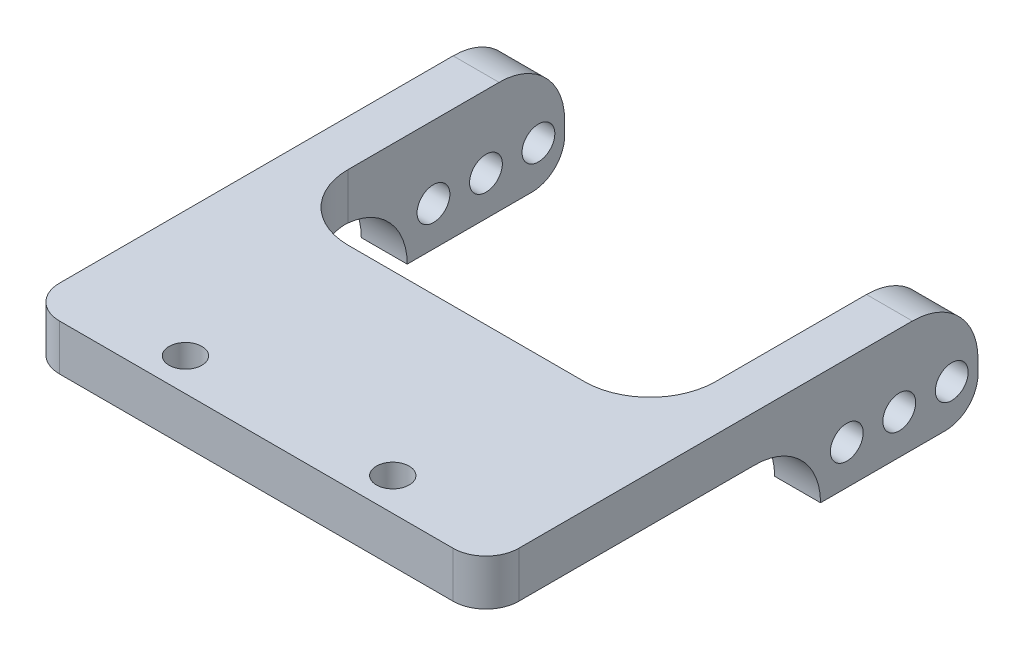
ISO-10303-21;
HEADER;
FILE_DESCRIPTION(('STEP AP214'),'2;1');
FILE_NAME('part.step','',(''),(''),'','','');
FILE_SCHEMA(('AUTOMOTIVE_DESIGN { 1 0 10303 214 1 1 1 1 }'));
ENDSEC;
DATA;
#1=APPLICATION_CONTEXT('core data for automotive mechanical design processes');
#2=APPLICATION_PROTOCOL_DEFINITION('international standard','automotive_design',2000,#1);
#3=PRODUCT_CONTEXT('',#1,'mechanical');
#4=PRODUCT('Part','Part','',(#3));
#5=PRODUCT_RELATED_PRODUCT_CATEGORY('part','',(#4));
#6=PRODUCT_DEFINITION_FORMATION('','',#4);
#7=PRODUCT_DEFINITION_CONTEXT('part definition',#1,'design');
#8=PRODUCT_DEFINITION('design','',#6,#7);
#9=PRODUCT_DEFINITION_SHAPE('','',#8);
#10=(LENGTH_UNIT() NAMED_UNIT(*) SI_UNIT(.MILLI.,.METRE.));
#11=(NAMED_UNIT(*) PLANE_ANGLE_UNIT() SI_UNIT($,.RADIAN.));
#12=(NAMED_UNIT(*) SI_UNIT($,.STERADIAN.) SOLID_ANGLE_UNIT());
#13=UNCERTAINTY_MEASURE_WITH_UNIT(LENGTH_MEASURE(1.E-05),#10,'distance_accuracy_value','');
#14=(GEOMETRIC_REPRESENTATION_CONTEXT(3) GLOBAL_UNCERTAINTY_ASSIGNED_CONTEXT((#13)) GLOBAL_UNIT_ASSIGNED_CONTEXT((#10,
#11,#12)) REPRESENTATION_CONTEXT('',''));
#15=CARTESIAN_POINT('',(0.,0.,0.));
#16=DIRECTION('',(0.,0.,1.));
#17=DIRECTION('',(1.,0.,0.));
#18=AXIS2_PLACEMENT_3D('',#15,#16,#17);
#19=CARTESIAN_POINT('',(65.,7.,70.));
#20=DIRECTION('',(0.,-1.,0.));
#21=DIRECTION('',(0.,0.,-1.));
#22=AXIS2_PLACEMENT_3D('',#19,#20,#21);
#23=CYLINDRICAL_SURFACE('',#22,5.);
#24=DIRECTION('',(0.,-1.,0.));
#25=VECTOR('',#24,1.);
#26=CARTESIAN_POINT('',(70.,7.,70.));
#27=LINE('',#26,#25);
#28=CARTESIAN_POINT('',(70.,7.,70.));
#29=VERTEX_POINT('',#28);
#30=CARTESIAN_POINT('',(70.,0.,70.));
#31=VERTEX_POINT('',#30);
#32=EDGE_CURVE('E341',#29,#31,#27,.T.);
#33=ORIENTED_EDGE('',*,*,#32,.F.);
#34=CARTESIAN_POINT('',(65.,7.,70.));
#35=DIRECTION('',(0.,1.,0.));
#36=DIRECTION('',(0.,0.,1.));
#37=AXIS2_PLACEMENT_3D('',#34,#35,#36);
#38=CIRCLE('',#37,5.);
#39=CARTESIAN_POINT('',(65.,7.,75.));
#40=VERTEX_POINT('',#39);
#41=EDGE_CURVE('E40',#40,#29,#38,.T.);
#42=ORIENTED_EDGE('',*,*,#41,.F.);
#43=DIRECTION('',(0.,-1.,0.));
#44=VECTOR('',#43,1.);
#45=CARTESIAN_POINT('',(65.,7.,75.));
#46=LINE('',#45,#44);
#47=CARTESIAN_POINT('',(65.,0.,75.));
#48=VERTEX_POINT('',#47);
#49=EDGE_CURVE('E342',#48,#40,#46,.F.);
#50=ORIENTED_EDGE('',*,*,#49,.F.);
#51=CARTESIAN_POINT('',(65.,0.,70.));
#52=DIRECTION('',(0.,1.,0.));
#53=DIRECTION('',(0.,0.,1.));
#54=AXIS2_PLACEMENT_3D('',#51,#52,#53);
#55=CIRCLE('',#54,5.);
#56=EDGE_CURVE('E11',#31,#48,#55,.F.);
#57=ORIENTED_EDGE('',*,*,#56,.F.);
#58=EDGE_LOOP('',(#33,#42,#50,#57));
#59=FACE_BOUND('',#58,.T.);
#60=ADVANCED_FACE('F33',(#59),#23,.T.);
#61=CARTESIAN_POINT('',(5.,7.,70.));
#62=DIRECTION('',(0.,1.,0.));
#63=DIRECTION('',(0.,0.,1.));
#64=AXIS2_PLACEMENT_3D('',#61,#62,#63);
#65=CYLINDRICAL_SURFACE('',#64,5.);
#66=DIRECTION('',(0.,1.,0.));
#67=VECTOR('',#66,1.);
#68=CARTESIAN_POINT('',(0.,7.,70.));
#69=LINE('',#68,#67);
#70=CARTESIAN_POINT('',(0.,0.,70.));
#71=VERTEX_POINT('',#70);
#72=CARTESIAN_POINT('',(0.,7.,70.));
#73=VERTEX_POINT('',#72);
#74=EDGE_CURVE('E359',#71,#73,#69,.T.);
#75=ORIENTED_EDGE('',*,*,#74,.F.);
#76=CARTESIAN_POINT('',(5.,0.,70.));
#77=DIRECTION('',(0.,1.,0.));
#78=DIRECTION('',(0.,0.,1.));
#79=AXIS2_PLACEMENT_3D('',#76,#77,#78);
#80=CIRCLE('',#79,5.);
#81=CARTESIAN_POINT('',(5.,0.,75.));
#82=VERTEX_POINT('',#81);
#83=EDGE_CURVE('E354',#82,#71,#80,.F.);
#84=ORIENTED_EDGE('',*,*,#83,.F.);
#85=DIRECTION('',(0.,1.,0.));
#86=VECTOR('',#85,1.);
#87=CARTESIAN_POINT('',(5.,7.,75.));
#88=LINE('',#87,#86);
#89=CARTESIAN_POINT('',(5.,7.,75.));
#90=VERTEX_POINT('',#89);
#91=EDGE_CURVE('E356',#90,#82,#88,.F.);
#92=ORIENTED_EDGE('',*,*,#91,.F.);
#93=CARTESIAN_POINT('',(5.,7.,70.));
#94=DIRECTION('',(0.,1.,0.));
#95=DIRECTION('',(0.,0.,1.));
#96=AXIS2_PLACEMENT_3D('',#93,#94,#95);
#97=CIRCLE('',#96,5.);
#98=EDGE_CURVE('E343',#73,#90,#97,.T.);
#99=ORIENTED_EDGE('',*,*,#98,.F.);
#100=EDGE_LOOP('',(#75,#84,#92,#99));
#101=FACE_BOUND('',#100,.T.);
#102=ADVANCED_FACE('F335',(#101),#65,.T.);
#103=CARTESIAN_POINT('',(0.,-5.,5.));
#104=DIRECTION('',(-1.,0.,0.));
#105=DIRECTION('',(0.,0.,1.));
#106=AXIS2_PLACEMENT_3D('',#103,#104,#105);
#107=CYLINDRICAL_SURFACE('',#106,5.);
#108=DIRECTION('',(-1.,0.,0.));
#109=VECTOR('',#108,1.);
#110=CARTESIAN_POINT('',(0.,-5.,0.));
#111=LINE('',#110,#109);
#112=CARTESIAN_POINT('',(7.,-5.,0.));
#113=VERTEX_POINT('',#112);
#114=CARTESIAN_POINT('',(0.,-5.,0.));
#115=VERTEX_POINT('',#114);
#116=EDGE_CURVE('E378',#113,#115,#111,.T.);
#117=ORIENTED_EDGE('',*,*,#116,.F.);
#118=CARTESIAN_POINT('',(7.,-5.,5.));
#119=DIRECTION('',(-1.,0.,0.));
#120=DIRECTION('',(0.,0.,1.));
#121=AXIS2_PLACEMENT_3D('',#118,#119,#120);
#122=CIRCLE('',#121,5.);
#123=CARTESIAN_POINT('',(7.,-10.,5.));
#124=VERTEX_POINT('',#123);
#125=EDGE_CURVE('E373',#124,#113,#122,.F.);
#126=ORIENTED_EDGE('',*,*,#125,.F.);
#127=DIRECTION('',(-1.,0.,0.));
#128=VECTOR('',#127,1.);
#129=CARTESIAN_POINT('',(0.,-10.,5.));
#130=LINE('',#129,#128);
#131=CARTESIAN_POINT('',(0.,-10.,5.));
#132=VERTEX_POINT('',#131);
#133=EDGE_CURVE('E375',#132,#124,#130,.F.);
#134=ORIENTED_EDGE('',*,*,#133,.F.);
#135=CARTESIAN_POINT('',(0.,-5.,5.));
#136=DIRECTION('',(1.,0.,0.));
#137=DIRECTION('',(0.,0.,-1.));
#138=AXIS2_PLACEMENT_3D('',#135,#136,#137);
#139=CIRCLE('',#138,5.);
#140=EDGE_CURVE('E362',#115,#132,#139,.F.);
#141=ORIENTED_EDGE('',*,*,#140,.F.);
#142=EDGE_LOOP('',(#117,#126,#134,#141));
#143=FACE_BOUND('',#142,.T.);
#144=ADVANCED_FACE('F339',(#143),#107,.T.);
#145=CARTESIAN_POINT('',(63.,-5.,5.));
#146=DIRECTION('',(-1.,0.,0.));
#147=DIRECTION('',(0.,0.,1.));
#148=AXIS2_PLACEMENT_3D('',#145,#146,#147);
#149=CYLINDRICAL_SURFACE('',#148,5.);
#150=DIRECTION('',(-1.,0.,0.));
#151=VECTOR('',#150,1.);
#152=CARTESIAN_POINT('',(63.,-5.,0.));
#153=LINE('',#152,#151);
#154=CARTESIAN_POINT('',(70.,-5.,0.));
#155=VERTEX_POINT('',#154);
#156=CARTESIAN_POINT('',(63.,-5.,0.));
#157=VERTEX_POINT('',#156);
#158=EDGE_CURVE('E386',#155,#157,#153,.T.);
#159=ORIENTED_EDGE('',*,*,#158,.F.);
#160=CARTESIAN_POINT('',(70.,-5.,5.));
#161=DIRECTION('',(-1.,0.,0.));
#162=DIRECTION('',(0.,0.,1.));
#163=AXIS2_PLACEMENT_3D('',#160,#161,#162);
#164=CIRCLE('',#163,5.);
#165=CARTESIAN_POINT('',(70.,-10.,5.));
#166=VERTEX_POINT('',#165);
#167=EDGE_CURVE('E383',#166,#155,#164,.F.);
#168=ORIENTED_EDGE('',*,*,#167,.F.);
#169=DIRECTION('',(-1.,0.,0.));
#170=VECTOR('',#169,1.);
#171=CARTESIAN_POINT('',(0.,-10.,5.));
#172=LINE('',#171,#170);
#173=CARTESIAN_POINT('',(63.,-10.,5.));
#174=VERTEX_POINT('',#173);
#175=EDGE_CURVE('E176',#174,#166,#172,.F.);
#176=ORIENTED_EDGE('',*,*,#175,.F.);
#177=CARTESIAN_POINT('',(63.,-5.,5.));
#178=DIRECTION('',(1.,0.,0.));
#179=DIRECTION('',(0.,0.,-1.));
#180=AXIS2_PLACEMENT_3D('',#177,#178,#179);
#181=CIRCLE('',#180,5.);
#182=EDGE_CURVE('E381',#157,#174,#181,.F.);
#183=ORIENTED_EDGE('',*,*,#182,.F.);
#184=EDGE_LOOP('',(#159,#168,#176,#183));
#185=FACE_BOUND('',#184,.T.);
#186=ADVANCED_FACE('F309',(#185),#149,.T.);
#187=CARTESIAN_POINT('',(53.,7.,33.));
#188=DIRECTION('',(0.,1.,0.));
#189=DIRECTION('',(0.,0.,1.));
#190=AXIS2_PLACEMENT_3D('',#187,#188,#189);
#191=CYLINDRICAL_SURFACE('',#190,10.);
#192=DIRECTION('',(0.,-1.,0.));
#193=VECTOR('',#192,1.);
#194=CARTESIAN_POINT('',(53.,7.,43.));
#195=LINE('',#194,#193);
#196=CARTESIAN_POINT('',(53.,7.,43.));
#197=VERTEX_POINT('',#196);
#198=CARTESIAN_POINT('',(53.,0.,43.));
#199=VERTEX_POINT('',#198);
#200=EDGE_CURVE('E395',#197,#199,#195,.T.);
#201=ORIENTED_EDGE('',*,*,#200,.F.);
#202=CARTESIAN_POINT('',(53.,7.,33.));
#203=DIRECTION('',(0.,1.,0.));
#204=DIRECTION('',(0.,0.,1.));
#205=AXIS2_PLACEMENT_3D('',#202,#203,#204);
#206=CIRCLE('',#205,10.);
#207=CARTESIAN_POINT('',(63.,7.,33.));
#208=VERTEX_POINT('',#207);
#209=EDGE_CURVE('E320',#197,#208,#206,.T.);
#210=ORIENTED_EDGE('',*,*,#209,.T.);
#211=DIRECTION('',(0.,-1.,0.));
#212=VECTOR('',#211,1.);
#213=CARTESIAN_POINT('',(63.,7.,33.));
#214=LINE('',#213,#212);
#215=CARTESIAN_POINT('',(63.,-0.0501256289338007,33.));
#216=VERTEX_POINT('',#215);
#217=EDGE_CURVE('E321',#216,#208,#214,.F.);
#218=ORIENTED_EDGE('',*,*,#217,.F.);
#219=CARTESIAN_POINT('',(63.,-0.0501256289338007,33.));
#220=CARTESIAN_POINT('',(63.0000017495242,-0.0392003633028899,33.1086874612133));
#221=CARTESIAN_POINT('',(62.9982276729581,-0.0300613805664736,33.2175390065828));
#222=CARTESIAN_POINT('',(62.9911123847289,-0.0153568587463886,33.435365318943));
#223=CARTESIAN_POINT('',(62.9857712198215,-0.00979127282640684,33.5443400843));
#224=CARTESIAN_POINT('',(62.9644944163454,0.00148053309849184,33.8693038814461));
#225=CARTESIAN_POINT('',(62.9433055107606,0.00194607016723625,34.0851772715012));
#226=CARTESIAN_POINT('',(62.8870007323322,-0.0109420612117538,34.5146216263943));
#227=CARTESIAN_POINT('',(62.851885734294,-0.0242948617077672,34.7281927349909));
#228=CARTESIAN_POINT('',(62.7678720364823,-0.0643913830066847,35.1531874359249));
#229=CARTESIAN_POINT('',(62.7188618141338,-0.091244866629087,35.3645786903827));
#230=CARTESIAN_POINT('',(62.6632717280559,-0.124517681074061,35.573165270587));
#231=B_SPLINE_CURVE_WITH_KNOTS('',3,(#219,#220,#221,#222,#223,#224,#225,#226,#227,#228,#229,
#230),.UNSPECIFIED.,.F.,.F.,(4,2,2,2,2,4),(0.,0.327645474661733,0.655286654804816,
1.30502828807962,1.95472911252779,2.60979966476001),.UNSPECIFIED.);
#232=CARTESIAN_POINT('',(62.9498743710662,0.,34.));
#233=VERTEX_POINT('',#232);
#234=EDGE_CURVE('E313',#233,#216,#231,.F.);
#235=ORIENTED_EDGE('',*,*,#234,.F.);
#236=CARTESIAN_POINT('',(53.,0.,33.));
#237=DIRECTION('',(0.,1.,0.));
#238=DIRECTION('',(0.,0.,1.));
#239=AXIS2_PLACEMENT_3D('',#236,#237,#238);
#240=CIRCLE('',#239,10.);
#241=EDGE_CURVE('E388',#233,#199,#240,.F.);
#242=ORIENTED_EDGE('',*,*,#241,.T.);
#243=EDGE_LOOP('',(#201,#210,#218,#235,#242));
#244=FACE_BOUND('',#243,.T.);
#245=ADVANCED_FACE('F303',(#244),#191,.F.);
#246=CARTESIAN_POINT('',(17.,7.,33.));
#247=DIRECTION('',(0.,1.,0.));
#248=DIRECTION('',(0.,0.,1.));
#249=AXIS2_PLACEMENT_3D('',#246,#247,#248);
#250=CYLINDRICAL_SURFACE('',#249,10.);
#251=DIRECTION('',(0.,-1.,0.));
#252=VECTOR('',#251,1.);
#253=CARTESIAN_POINT('',(7.,7.,33.));
#254=LINE('',#253,#252);
#255=CARTESIAN_POINT('',(7.,7.,33.));
#256=VERTEX_POINT('',#255);
#257=CARTESIAN_POINT('',(7.,-0.0501256289338007,33.));
#258=VERTEX_POINT('',#257);
#259=EDGE_CURVE('E276',#256,#258,#254,.T.);
#260=ORIENTED_EDGE('',*,*,#259,.F.);
#261=CARTESIAN_POINT('',(17.,7.,33.));
#262=DIRECTION('',(0.,1.,0.));
#263=DIRECTION('',(0.,0.,1.));
#264=AXIS2_PLACEMENT_3D('',#261,#262,#263);
#265=CIRCLE('',#264,10.);
#266=CARTESIAN_POINT('',(17.,7.,43.));
#267=VERTEX_POINT('',#266);
#268=EDGE_CURVE('E291',#256,#267,#265,.T.);
#269=ORIENTED_EDGE('',*,*,#268,.T.);
#270=DIRECTION('',(0.,-1.,0.));
#271=VECTOR('',#270,1.);
#272=CARTESIAN_POINT('',(17.,7.,43.));
#273=LINE('',#272,#271);
#274=CARTESIAN_POINT('',(17.,0.,43.));
#275=VERTEX_POINT('',#274);
#276=EDGE_CURVE('E279',#275,#267,#273,.F.);
#277=ORIENTED_EDGE('',*,*,#276,.F.);
#278=CARTESIAN_POINT('',(17.,0.,33.));
#279=DIRECTION('',(0.,1.,0.));
#280=DIRECTION('',(0.,0.,1.));
#281=AXIS2_PLACEMENT_3D('',#278,#279,#280);
#282=CIRCLE('',#281,10.);
#283=CARTESIAN_POINT('',(7.0501256289338,0.,34.));
#284=VERTEX_POINT('',#283);
#285=EDGE_CURVE('E399',#275,#284,#282,.F.);
#286=ORIENTED_EDGE('',*,*,#285,.T.);
#287=CARTESIAN_POINT('',(7.,-0.0501256289338007,33.));
#288=CARTESIAN_POINT('',(6.99999825047578,-0.0392003633028899,33.1086874612133));
#289=CARTESIAN_POINT('',(7.00177232704194,-0.0300613805664737,33.2175390065828));
#290=CARTESIAN_POINT('',(7.00888761527107,-0.0153568587463886,33.435365318943));
#291=CARTESIAN_POINT('',(7.01422878017853,-0.00979127282640691,33.5443400843));
#292=CARTESIAN_POINT('',(7.03550558365462,0.00148053309849174,33.8693038814461));
#293=CARTESIAN_POINT('',(7.05669448923945,0.0019460701672362,34.0851772715012));
#294=CARTESIAN_POINT('',(7.11299926766785,-0.0109420612117538,34.5146216263943));
#295=CARTESIAN_POINT('',(7.14811426570601,-0.0242948617077673,34.7281927349909));
#296=CARTESIAN_POINT('',(7.23212796351774,-0.0643913830066849,35.1531874359249));
#297=CARTESIAN_POINT('',(7.28113818586621,-0.0912448666290872,35.3645786903827));
#298=CARTESIAN_POINT('',(7.33672827194409,-0.124517681074061,35.573165270587));
#299=B_SPLINE_CURVE_WITH_KNOTS('',3,(#287,#288,#289,#290,#291,#292,#293,#294,#295,#296,#297,
#298),.UNSPECIFIED.,.F.,.F.,(4,2,2,2,2,4),(0.,0.327645474661732,0.655286654804816,
1.30502828807962,1.95472911252779,2.60979966476001),.UNSPECIFIED.);
#300=EDGE_CURVE('E282',#258,#284,#299,.T.);
#301=ORIENTED_EDGE('',*,*,#300,.F.);
#302=EDGE_LOOP('',(#260,#269,#277,#286,#301));
#303=FACE_BOUND('',#302,.T.);
#304=ADVANCED_FACE('F297',(#303),#250,.F.);
#305=CARTESIAN_POINT('',(63.,-3.,10.));
#306=DIRECTION('',(-1.,0.,0.));
#307=DIRECTION('',(0.,0.,1.));
#308=AXIS2_PLACEMENT_3D('',#305,#306,#307);
#309=CYLINDRICAL_SURFACE('',#308,10.);
#310=DIRECTION('',(1.,0.,0.));
#311=VECTOR('',#310,1.);
#312=CARTESIAN_POINT('',(63.,-3.,0.));
#313=LINE('',#312,#311);
#314=CARTESIAN_POINT('',(63.,-3.,0.));
#315=VERTEX_POINT('',#314);
#316=CARTESIAN_POINT('',(70.,-3.,0.));
#317=VERTEX_POINT('',#316);
#318=EDGE_CURVE('E265',#315,#317,#313,.T.);
#319=ORIENTED_EDGE('',*,*,#318,.F.);
#320=CARTESIAN_POINT('',(63.,-3.,10.));
#321=DIRECTION('',(1.,0.,0.));
#322=DIRECTION('',(0.,0.,-1.));
#323=AXIS2_PLACEMENT_3D('',#320,#321,#322);
#324=CIRCLE('',#323,10.);
#325=CARTESIAN_POINT('',(63.,7.,10.));
#326=VERTEX_POINT('',#325);
#327=EDGE_CURVE('E271',#326,#315,#324,.F.);
#328=ORIENTED_EDGE('',*,*,#327,.F.);
#329=DIRECTION('',(1.,0.,0.));
#330=VECTOR('',#329,1.);
#331=CARTESIAN_POINT('',(63.,7.,10.));
#332=LINE('',#331,#330);
#333=CARTESIAN_POINT('',(70.,7.,10.));
#334=VERTEX_POINT('',#333);
#335=EDGE_CURVE('E268',#334,#326,#332,.F.);
#336=ORIENTED_EDGE('',*,*,#335,.F.);
#337=CARTESIAN_POINT('',(70.,-3.,10.));
#338=DIRECTION('',(-1.,0.,0.));
#339=DIRECTION('',(0.,0.,1.));
#340=AXIS2_PLACEMENT_3D('',#337,#338,#339);
#341=CIRCLE('',#340,10.);
#342=EDGE_CURVE('E273',#317,#334,#341,.F.);
#343=ORIENTED_EDGE('',*,*,#342,.F.);
#344=EDGE_LOOP('',(#319,#328,#336,#343));
#345=FACE_BOUND('',#344,.T.);
#346=ADVANCED_FACE('F302',(#345),#309,.T.);
#347=CARTESIAN_POINT('',(0.,-3.,10.));
#348=DIRECTION('',(1.,0.,0.));
#349=DIRECTION('',(0.,0.,-1.));
#350=AXIS2_PLACEMENT_3D('',#347,#348,#349);
#351=CYLINDRICAL_SURFACE('',#350,10.);
#352=DIRECTION('',(-1.,0.,0.));
#353=VECTOR('',#352,1.);
#354=CARTESIAN_POINT('',(0.,7.,10.));
#355=LINE('',#354,#353);
#356=CARTESIAN_POINT('',(7.,7.,10.));
#357=VERTEX_POINT('',#356);
#358=CARTESIAN_POINT('',(0.,7.,10.));
#359=VERTEX_POINT('',#358);
#360=EDGE_CURVE('E188',#357,#359,#355,.T.);
#361=ORIENTED_EDGE('',*,*,#360,.F.);
#362=CARTESIAN_POINT('',(7.,-3.,10.));
#363=DIRECTION('',(-1.,0.,0.));
#364=DIRECTION('',(0.,0.,1.));
#365=AXIS2_PLACEMENT_3D('',#362,#363,#364);
#366=CIRCLE('',#365,10.);
#367=CARTESIAN_POINT('',(7.,-3.,0.));
#368=VERTEX_POINT('',#367);
#369=EDGE_CURVE('E260',#368,#357,#366,.F.);
#370=ORIENTED_EDGE('',*,*,#369,.F.);
#371=DIRECTION('',(-1.,0.,0.));
#372=VECTOR('',#371,1.);
#373=CARTESIAN_POINT('',(0.,-3.,0.));
#374=LINE('',#373,#372);
#375=CARTESIAN_POINT('',(0.,-3.,0.));
#376=VERTEX_POINT('',#375);
#377=EDGE_CURVE('E257',#376,#368,#374,.F.);
#378=ORIENTED_EDGE('',*,*,#377,.F.);
#379=CARTESIAN_POINT('',(0.,-3.,10.));
#380=DIRECTION('',(1.,0.,0.));
#381=DIRECTION('',(0.,0.,-1.));
#382=AXIS2_PLACEMENT_3D('',#379,#380,#381);
#383=CIRCLE('',#382,10.);
#384=EDGE_CURVE('E263',#359,#376,#383,.F.);
#385=ORIENTED_EDGE('',*,*,#384,.F.);
#386=EDGE_LOOP('',(#361,#370,#378,#385));
#387=FACE_BOUND('',#386,.T.);
#388=ADVANCED_FACE('F326',(#387),#351,.T.);
#389=CARTESIAN_POINT('',(0.,-10.,34.));
#390=DIRECTION('',(-1.,0.,0.));
#391=DIRECTION('',(0.,0.,1.));
#392=AXIS2_PLACEMENT_3D('',#389,#390,#391);
#393=CYLINDRICAL_SURFACE('',#392,10.);
#394=DIRECTION('',(1.,0.,0.));
#395=VECTOR('',#394,1.);
#396=CARTESIAN_POINT('',(0.,0.,34.));
#397=LINE('',#396,#395);
#398=CARTESIAN_POINT('',(70.,0.,34.));
#399=VERTEX_POINT('',#398);
#400=EDGE_CURVE('E247',#233,#399,#397,.T.);
#401=ORIENTED_EDGE('',*,*,#400,.F.);
#402=ORIENTED_EDGE('',*,*,#234,.T.);
#403=CARTESIAN_POINT('',(63.,-10.,34.));
#404=DIRECTION('',(1.,0.,0.));
#405=DIRECTION('',(0.,0.,-1.));
#406=AXIS2_PLACEMENT_3D('',#403,#404,#405);
#407=CIRCLE('',#406,10.);
#408=CARTESIAN_POINT('',(63.,-10.,24.));
#409=VERTEX_POINT('',#408);
#410=EDGE_CURVE('E189',#216,#409,#407,.F.);
#411=ORIENTED_EDGE('',*,*,#410,.T.);
#412=DIRECTION('',(-1.,0.,0.));
#413=VECTOR('',#412,1.);
#414=CARTESIAN_POINT('',(63.,-10.,24.));
#415=LINE('',#414,#413);
#416=CARTESIAN_POINT('',(70.,-10.,24.));
#417=VERTEX_POINT('',#416);
#418=EDGE_CURVE('E173',#417,#409,#415,.T.);
#419=ORIENTED_EDGE('',*,*,#418,.F.);
#420=CARTESIAN_POINT('',(70.,-10.,34.));
#421=DIRECTION('',(-1.,0.,0.));
#422=DIRECTION('',(0.,0.,1.));
#423=AXIS2_PLACEMENT_3D('',#420,#421,#422);
#424=CIRCLE('',#423,10.);
#425=EDGE_CURVE('E181',#417,#399,#424,.F.);
#426=ORIENTED_EDGE('',*,*,#425,.T.);
#427=EDGE_LOOP('',(#401,#402,#411,#419,#426));
#428=FACE_BOUND('',#427,.T.);
#429=ADVANCED_FACE('F191',(#428),#393,.F.);
#430=CARTESIAN_POINT('',(0.,-10.,34.));
#431=DIRECTION('',(-1.,0.,0.));
#432=DIRECTION('',(0.,0.,1.));
#433=AXIS2_PLACEMENT_3D('',#430,#431,#432);
#434=CYLINDRICAL_SURFACE('',#433,10.);
#435=DIRECTION('',(1.,0.,0.));
#436=VECTOR('',#435,1.);
#437=CARTESIAN_POINT('',(0.,0.,34.));
#438=LINE('',#437,#436);
#439=CARTESIAN_POINT('',(0.,0.,34.));
#440=VERTEX_POINT('',#439);
#441=EDGE_CURVE('E240',#440,#284,#438,.T.);
#442=ORIENTED_EDGE('',*,*,#441,.F.);
#443=CARTESIAN_POINT('',(0.,-10.,34.));
#444=DIRECTION('',(1.,0.,0.));
#445=DIRECTION('',(0.,0.,-1.));
#446=AXIS2_PLACEMENT_3D('',#443,#444,#445);
#447=CIRCLE('',#446,10.);
#448=CARTESIAN_POINT('',(0.,-10.,24.));
#449=VERTEX_POINT('',#448);
#450=EDGE_CURVE('E242',#440,#449,#447,.F.);
#451=ORIENTED_EDGE('',*,*,#450,.T.);
#452=DIRECTION('',(-1.,0.,0.));
#453=VECTOR('',#452,1.);
#454=CARTESIAN_POINT('',(0.,-10.,24.));
#455=LINE('',#454,#453);
#456=CARTESIAN_POINT('',(7.,-10.,24.));
#457=VERTEX_POINT('',#456);
#458=EDGE_CURVE('E201',#457,#449,#455,.T.);
#459=ORIENTED_EDGE('',*,*,#458,.F.);
#460=CARTESIAN_POINT('',(7.,-10.,34.));
#461=DIRECTION('',(-1.,0.,0.));
#462=DIRECTION('',(0.,0.,1.));
#463=AXIS2_PLACEMENT_3D('',#460,#461,#462);
#464=CIRCLE('',#463,10.);
#465=EDGE_CURVE('E244',#457,#258,#464,.F.);
#466=ORIENTED_EDGE('',*,*,#465,.T.);
#467=ORIENTED_EDGE('',*,*,#300,.T.);
#468=EDGE_LOOP('',(#442,#451,#459,#466,#467));
#469=FACE_BOUND('',#468,.T.);
#470=ADVANCED_FACE('F293',(#469),#434,.F.);
#471=CARTESIAN_POINT('',(0.,0.,0.));
#472=DIRECTION('',(0.,1.,0.));
#473=DIRECTION('',(0.,0.,1.));
#474=AXIS2_PLACEMENT_3D('',#471,#472,#473);
#475=PLANE('',#474);
#476=CARTESIAN_POINT('',(19.2,0.,70.));
#477=DIRECTION('',(0.,1.,0.));
#478=DIRECTION('',(0.,0.,1.));
#479=AXIS2_PLACEMENT_3D('',#476,#477,#478);
#480=CIRCLE('',#479,2.5);
#481=CARTESIAN_POINT('',(19.2,0.,72.5));
#482=VERTEX_POINT('',#481);
#483=EDGE_CURVE('E495',#482,#482,#480,.T.);
#484=ORIENTED_EDGE('',*,*,#483,.T.);
#485=EDGE_LOOP('',(#484));
#486=FACE_BOUND('',#485,.T.);
#487=CARTESIAN_POINT('',(50.8,0.,70.));
#488=DIRECTION('',(0.,1.,0.));
#489=DIRECTION('',(0.,0.,1.));
#490=AXIS2_PLACEMENT_3D('',#487,#488,#489);
#491=CIRCLE('',#490,2.5);
#492=CARTESIAN_POINT('',(50.8,0.,72.5));
#493=VERTEX_POINT('',#492);
#494=EDGE_CURVE('E497',#493,#493,#491,.T.);
#495=ORIENTED_EDGE('',*,*,#494,.T.);
#496=EDGE_LOOP('',(#495));
#497=FACE_BOUND('',#496,.T.);
#498=DIRECTION('',(0.,0.,-1.));
#499=VECTOR('',#498,1.);
#500=CARTESIAN_POINT('',(70.,0.,0.));
#501=LINE('',#500,#499);
#502=EDGE_CURVE('E185',#31,#399,#501,.T.);
#503=ORIENTED_EDGE('',*,*,#502,.F.);
#504=ORIENTED_EDGE('',*,*,#56,.T.);
#505=DIRECTION('',(1.,0.,0.));
#506=VECTOR('',#505,1.);
#507=CARTESIAN_POINT('',(0.,0.,75.));
#508=LINE('',#507,#506);
#509=EDGE_CURVE('E224',#82,#48,#508,.T.);
#510=ORIENTED_EDGE('',*,*,#509,.F.);
#511=ORIENTED_EDGE('',*,*,#83,.T.);
#512=DIRECTION('',(0.,0.,1.));
#513=VECTOR('',#512,1.);
#514=CARTESIAN_POINT('',(0.,0.,0.));
#515=LINE('',#514,#513);
#516=EDGE_CURVE('E204',#440,#71,#515,.T.);
#517=ORIENTED_EDGE('',*,*,#516,.F.);
#518=ORIENTED_EDGE('',*,*,#441,.T.);
#519=ORIENTED_EDGE('',*,*,#285,.F.);
#520=DIRECTION('',(-1.,0.,0.));
#521=VECTOR('',#520,1.);
#522=CARTESIAN_POINT('',(7.,0.,43.));
#523=LINE('',#522,#521);
#524=EDGE_CURVE('E209',#199,#275,#523,.T.);
#525=ORIENTED_EDGE('',*,*,#524,.F.);
#526=ORIENTED_EDGE('',*,*,#241,.F.);
#527=ORIENTED_EDGE('',*,*,#400,.T.);
#528=EDGE_LOOP('',(#503,#504,#510,#511,#517,#518,#519,#525,#526,#527));
#529=FACE_BOUND('',#528,.T.);
#530=ADVANCED_FACE('F409',(#486,#497,#529),#475,.F.);
#531=CARTESIAN_POINT('',(0.,7.,0.));
#532=DIRECTION('',(1.,0.,0.));
#533=DIRECTION('',(0.,0.,-1.));
#534=AXIS2_PLACEMENT_3D('',#531,#532,#533);
#535=PLANE('',#534);
#536=CARTESIAN_POINT('',(0.,-4.,4.));
#537=DIRECTION('',(1.,0.,0.));
#538=DIRECTION('',(0.,0.,-1.));
#539=AXIS2_PLACEMENT_3D('',#536,#537,#538);
#540=CIRCLE('',#539,2.5);
#541=CARTESIAN_POINT('',(0.,-4.,1.5));
#542=VERTEX_POINT('',#541);
#543=EDGE_CURVE('E371',#542,#542,#540,.T.);
#544=ORIENTED_EDGE('',*,*,#543,.T.);
#545=EDGE_LOOP('',(#544));
#546=FACE_BOUND('',#545,.T.);
#547=CARTESIAN_POINT('',(0.,-4.,20.));
#548=DIRECTION('',(1.,0.,0.));
#549=DIRECTION('',(0.,0.,-1.));
#550=AXIS2_PLACEMENT_3D('',#547,#548,#549);
#551=CIRCLE('',#550,2.5);
#552=CARTESIAN_POINT('',(0.,-4.,17.5));
#553=VERTEX_POINT('',#552);
#554=EDGE_CURVE('E500',#553,#553,#551,.T.);
#555=ORIENTED_EDGE('',*,*,#554,.T.);
#556=EDGE_LOOP('',(#555));
#557=FACE_BOUND('',#556,.T.);
#558=CARTESIAN_POINT('',(0.,-4.,12.));
#559=DIRECTION('',(1.,0.,0.));
#560=DIRECTION('',(0.,0.,-1.));
#561=AXIS2_PLACEMENT_3D('',#558,#559,#560);
#562=CIRCLE('',#561,2.5);
#563=CARTESIAN_POINT('',(0.,-4.,9.5));
#564=VERTEX_POINT('',#563);
#565=EDGE_CURVE('E254',#564,#564,#562,.T.);
#566=ORIENTED_EDGE('',*,*,#565,.T.);
#567=EDGE_LOOP('',(#566));
#568=FACE_BOUND('',#567,.T.);
#569=ORIENTED_EDGE('',*,*,#516,.T.);
#570=ORIENTED_EDGE('',*,*,#74,.T.);
#571=DIRECTION('',(0.,0.,1.));
#572=VECTOR('',#571,1.);
#573=CARTESIAN_POINT('',(0.,7.,0.));
#574=LINE('',#573,#572);
#575=EDGE_CURVE('E205',#359,#73,#574,.T.);
#576=ORIENTED_EDGE('',*,*,#575,.F.);
#577=ORIENTED_EDGE('',*,*,#384,.T.);
#578=DIRECTION('',(0.,-1.,0.));
#579=VECTOR('',#578,1.);
#580=CARTESIAN_POINT('',(0.,7.,0.));
#581=LINE('',#580,#579);
#582=EDGE_CURVE('E221',#376,#115,#581,.T.);
#583=ORIENTED_EDGE('',*,*,#582,.T.);
#584=ORIENTED_EDGE('',*,*,#140,.T.);
#585=DIRECTION('',(0.,0.,-1.));
#586=VECTOR('',#585,1.);
#587=CARTESIAN_POINT('',(0.,-10.,0.));
#588=LINE('',#587,#586);
#589=EDGE_CURVE('E193',#449,#132,#588,.T.);
#590=ORIENTED_EDGE('',*,*,#589,.F.);
#591=ORIENTED_EDGE('',*,*,#450,.F.);
#592=EDGE_LOOP('',(#569,#570,#576,#577,#583,#584,#590,#591));
#593=FACE_BOUND('',#592,.T.);
#594=ADVANCED_FACE('F421',(#546,#557,#568,#593),#535,.F.);
#595=CARTESIAN_POINT('',(0.,7.,75.));
#596=DIRECTION('',(0.,0.,-1.));
#597=DIRECTION('',(-1.,0.,0.));
#598=AXIS2_PLACEMENT_3D('',#595,#596,#597);
#599=PLANE('',#598);
#600=ORIENTED_EDGE('',*,*,#509,.T.);
#601=ORIENTED_EDGE('',*,*,#49,.T.);
#602=DIRECTION('',(1.,0.,0.));
#603=VECTOR('',#602,1.);
#604=CARTESIAN_POINT('',(0.,7.,75.));
#605=LINE('',#604,#603);
#606=EDGE_CURVE('E208',#90,#40,#605,.T.);
#607=ORIENTED_EDGE('',*,*,#606,.F.);
#608=ORIENTED_EDGE('',*,*,#91,.T.);
#609=EDGE_LOOP('',(#600,#601,#607,#608));
#610=FACE_BOUND('',#609,.T.);
#611=ADVANCED_FACE('F426',(#610),#599,.F.);
#612=CARTESIAN_POINT('',(70.,7.,0.));
#613=DIRECTION('',(-1.,0.,0.));
#614=DIRECTION('',(0.,0.,1.));
#615=AXIS2_PLACEMENT_3D('',#612,#613,#614);
#616=PLANE('',#615);
#617=CARTESIAN_POINT('',(70.,-4.,4.));
#618=DIRECTION('',(1.,0.,0.));
#619=DIRECTION('',(0.,0.,-1.));
#620=AXIS2_PLACEMENT_3D('',#617,#618,#619);
#621=CIRCLE('',#620,2.5);
#622=CARTESIAN_POINT('',(70.,-4.,1.5));
#623=VERTEX_POINT('',#622);
#624=EDGE_CURVE('E508',#623,#623,#621,.T.);
#625=ORIENTED_EDGE('',*,*,#624,.F.);
#626=EDGE_LOOP('',(#625));
#627=FACE_BOUND('',#626,.T.);
#628=CARTESIAN_POINT('',(70.,-4.,20.));
#629=DIRECTION('',(1.,0.,0.));
#630=DIRECTION('',(0.,0.,-1.));
#631=AXIS2_PLACEMENT_3D('',#628,#629,#630);
#632=CIRCLE('',#631,2.5);
#633=CARTESIAN_POINT('',(70.,-4.,17.5));
#634=VERTEX_POINT('',#633);
#635=EDGE_CURVE('E496',#634,#634,#632,.T.);
#636=ORIENTED_EDGE('',*,*,#635,.F.);
#637=EDGE_LOOP('',(#636));
#638=FACE_BOUND('',#637,.T.);
#639=CARTESIAN_POINT('',(70.,-4.,12.));
#640=DIRECTION('',(1.,0.,0.));
#641=DIRECTION('',(0.,0.,-1.));
#642=AXIS2_PLACEMENT_3D('',#639,#640,#641);
#643=CIRCLE('',#642,2.5);
#644=CARTESIAN_POINT('',(70.,-4.,9.5));
#645=VERTEX_POINT('',#644);
#646=EDGE_CURVE('E517',#645,#645,#643,.T.);
#647=ORIENTED_EDGE('',*,*,#646,.F.);
#648=EDGE_LOOP('',(#647));
#649=FACE_BOUND('',#648,.T.);
#650=DIRECTION('',(0.,0.,-1.));
#651=VECTOR('',#650,1.);
#652=CARTESIAN_POINT('',(70.,7.,0.));
#653=LINE('',#652,#651);
#654=EDGE_CURVE('E212',#29,#334,#653,.T.);
#655=ORIENTED_EDGE('',*,*,#654,.F.);
#656=ORIENTED_EDGE('',*,*,#32,.T.);
#657=ORIENTED_EDGE('',*,*,#502,.T.);
#658=ORIENTED_EDGE('',*,*,#425,.F.);
#659=DIRECTION('',(0.,0.,1.));
#660=VECTOR('',#659,1.);
#661=CARTESIAN_POINT('',(70.,-10.,0.));
#662=LINE('',#661,#660);
#663=EDGE_CURVE('E168',#166,#417,#662,.T.);
#664=ORIENTED_EDGE('',*,*,#663,.F.);
#665=ORIENTED_EDGE('',*,*,#167,.T.);
#666=DIRECTION('',(0.,-1.,0.));
#667=VECTOR('',#666,1.);
#668=CARTESIAN_POINT('',(70.,7.,0.));
#669=LINE('',#668,#667);
#670=EDGE_CURVE('E237',#317,#155,#669,.T.);
#671=ORIENTED_EDGE('',*,*,#670,.F.);
#672=ORIENTED_EDGE('',*,*,#342,.T.);
#673=EDGE_LOOP('',(#655,#656,#657,#658,#664,#665,#671,#672));
#674=FACE_BOUND('',#673,.T.);
#675=ADVANCED_FACE('F183',(#627,#638,#649,#674),#616,.F.);
#676=CARTESIAN_POINT('',(63.,7.,0.));
#677=DIRECTION('',(0.,0.,1.));
#678=DIRECTION('',(1.,0.,0.));
#679=AXIS2_PLACEMENT_3D('',#676,#677,#678);
#680=PLANE('',#679);
#681=ORIENTED_EDGE('',*,*,#670,.T.);
#682=ORIENTED_EDGE('',*,*,#158,.T.);
#683=DIRECTION('',(0.,-1.,0.));
#684=VECTOR('',#683,1.);
#685=CARTESIAN_POINT('',(63.,7.,0.));
#686=LINE('',#685,#684);
#687=EDGE_CURVE('E234',#315,#157,#686,.T.);
#688=ORIENTED_EDGE('',*,*,#687,.F.);
#689=ORIENTED_EDGE('',*,*,#318,.T.);
#690=EDGE_LOOP('',(#681,#682,#688,#689));
#691=FACE_BOUND('',#690,.T.);
#692=ADVANCED_FACE('F433',(#691),#680,.F.);
#693=CARTESIAN_POINT('',(63.,7.,43.));
#694=DIRECTION('',(1.,0.,0.));
#695=DIRECTION('',(0.,0.,-1.));
#696=AXIS2_PLACEMENT_3D('',#693,#694,#695);
#697=PLANE('',#696);
#698=CARTESIAN_POINT('',(63.,-4.,4.));
#699=DIRECTION('',(1.,0.,0.));
#700=DIRECTION('',(0.,0.,-1.));
#701=AXIS2_PLACEMENT_3D('',#698,#699,#700);
#702=CIRCLE('',#701,2.5);
#703=CARTESIAN_POINT('',(63.,-4.,1.5));
#704=VERTEX_POINT('',#703);
#705=EDGE_CURVE('E366',#704,#704,#702,.T.);
#706=ORIENTED_EDGE('',*,*,#705,.T.);
#707=EDGE_LOOP('',(#706));
#708=FACE_BOUND('',#707,.T.);
#709=CARTESIAN_POINT('',(63.,-4.,20.));
#710=DIRECTION('',(1.,0.,0.));
#711=DIRECTION('',(0.,0.,-1.));
#712=AXIS2_PLACEMENT_3D('',#709,#710,#711);
#713=CIRCLE('',#712,2.5);
#714=CARTESIAN_POINT('',(63.,-4.,17.5));
#715=VERTEX_POINT('',#714);
#716=EDGE_CURVE('E367',#715,#715,#713,.T.);
#717=ORIENTED_EDGE('',*,*,#716,.T.);
#718=EDGE_LOOP('',(#717));
#719=FACE_BOUND('',#718,.T.);
#720=CARTESIAN_POINT('',(63.,-4.,12.));
#721=DIRECTION('',(1.,0.,0.));
#722=DIRECTION('',(0.,0.,-1.));
#723=AXIS2_PLACEMENT_3D('',#720,#721,#722);
#724=CIRCLE('',#723,2.5);
#725=CARTESIAN_POINT('',(63.,-4.,9.5));
#726=VERTEX_POINT('',#725);
#727=EDGE_CURVE('E253',#726,#726,#724,.T.);
#728=ORIENTED_EDGE('',*,*,#727,.T.);
#729=EDGE_LOOP('',(#728));
#730=FACE_BOUND('',#729,.T.);
#731=ORIENTED_EDGE('',*,*,#687,.T.);
#732=ORIENTED_EDGE('',*,*,#182,.T.);
#733=DIRECTION('',(0.,0.,-1.));
#734=VECTOR('',#733,1.);
#735=CARTESIAN_POINT('',(63.,-10.,0.));
#736=LINE('',#735,#734);
#737=EDGE_CURVE('E178',#409,#174,#736,.T.);
#738=ORIENTED_EDGE('',*,*,#737,.F.);
#739=ORIENTED_EDGE('',*,*,#410,.F.);
#740=ORIENTED_EDGE('',*,*,#217,.T.);
#741=DIRECTION('',(0.,0.,1.));
#742=VECTOR('',#741,1.);
#743=CARTESIAN_POINT('',(63.,7.,43.));
#744=LINE('',#743,#742);
#745=EDGE_CURVE('E214',#326,#208,#744,.T.);
#746=ORIENTED_EDGE('',*,*,#745,.F.);
#747=ORIENTED_EDGE('',*,*,#327,.T.);
#748=EDGE_LOOP('',(#731,#732,#738,#739,#740,#746,#747));
#749=FACE_BOUND('',#748,.T.);
#750=ADVANCED_FACE('F398',(#708,#719,#730,#749),#697,.F.);
#751=CARTESIAN_POINT('',(7.,7.,43.));
#752=DIRECTION('',(0.,0.,1.));
#753=DIRECTION('',(1.,0.,0.));
#754=AXIS2_PLACEMENT_3D('',#751,#752,#753);
#755=PLANE('',#754);
#756=DIRECTION('',(-1.,0.,0.));
#757=VECTOR('',#756,1.);
#758=CARTESIAN_POINT('',(35.,7.,43.));
#759=LINE('',#758,#757);
#760=EDGE_CURVE('E217',#197,#267,#759,.T.);
#761=ORIENTED_EDGE('',*,*,#760,.F.);
#762=ORIENTED_EDGE('',*,*,#200,.T.);
#763=ORIENTED_EDGE('',*,*,#524,.T.);
#764=ORIENTED_EDGE('',*,*,#276,.T.);
#765=EDGE_LOOP('',(#761,#762,#763,#764));
#766=FACE_BOUND('',#765,.T.);
#767=ADVANCED_FACE('F408',(#766),#755,.F.);
#768=CARTESIAN_POINT('',(7.,7.,43.));
#769=DIRECTION('',(-1.,0.,0.));
#770=DIRECTION('',(0.,0.,1.));
#771=AXIS2_PLACEMENT_3D('',#768,#769,#770);
#772=PLANE('',#771);
#773=CARTESIAN_POINT('',(7.,-4.,4.));
#774=DIRECTION('',(-1.,0.,0.));
#775=DIRECTION('',(0.,0.,1.));
#776=AXIS2_PLACEMENT_3D('',#773,#774,#775);
#777=CIRCLE('',#776,2.5);
#778=CARTESIAN_POINT('',(7.,-4.,6.5));
#779=VERTEX_POINT('',#778);
#780=EDGE_CURVE('E363',#779,#779,#777,.T.);
#781=ORIENTED_EDGE('',*,*,#780,.T.);
#782=EDGE_LOOP('',(#781));
#783=FACE_BOUND('',#782,.T.);
#784=CARTESIAN_POINT('',(7.,-4.,20.));
#785=DIRECTION('',(-1.,0.,0.));
#786=DIRECTION('',(0.,0.,1.));
#787=AXIS2_PLACEMENT_3D('',#784,#785,#786);
#788=CIRCLE('',#787,2.5);
#789=CARTESIAN_POINT('',(7.,-4.,22.5));
#790=VERTEX_POINT('',#789);
#791=EDGE_CURVE('E368',#790,#790,#788,.T.);
#792=ORIENTED_EDGE('',*,*,#791,.T.);
#793=EDGE_LOOP('',(#792));
#794=FACE_BOUND('',#793,.T.);
#795=CARTESIAN_POINT('',(7.,-4.,12.));
#796=DIRECTION('',(-1.,0.,0.));
#797=DIRECTION('',(0.,0.,1.));
#798=AXIS2_PLACEMENT_3D('',#795,#796,#797);
#799=CIRCLE('',#798,2.5);
#800=CARTESIAN_POINT('',(7.,-4.,14.5));
#801=VERTEX_POINT('',#800);
#802=EDGE_CURVE('E250',#801,#801,#799,.T.);
#803=ORIENTED_EDGE('',*,*,#802,.T.);
#804=EDGE_LOOP('',(#803));
#805=FACE_BOUND('',#804,.T.);
#806=DIRECTION('',(0.,0.,1.));
#807=VECTOR('',#806,1.);
#808=CARTESIAN_POINT('',(7.,-10.,0.));
#809=LINE('',#808,#807);
#810=EDGE_CURVE('E196',#124,#457,#809,.T.);
#811=ORIENTED_EDGE('',*,*,#810,.F.);
#812=ORIENTED_EDGE('',*,*,#125,.T.);
#813=DIRECTION('',(0.,-1.,0.));
#814=VECTOR('',#813,1.);
#815=CARTESIAN_POINT('',(7.,7.,0.));
#816=LINE('',#815,#814);
#817=EDGE_CURVE('E231',#368,#113,#816,.T.);
#818=ORIENTED_EDGE('',*,*,#817,.F.);
#819=ORIENTED_EDGE('',*,*,#369,.T.);
#820=DIRECTION('',(0.,0.,-1.));
#821=VECTOR('',#820,1.);
#822=CARTESIAN_POINT('',(7.,7.,43.));
#823=LINE('',#822,#821);
#824=EDGE_CURVE('E219',#256,#357,#823,.T.);
#825=ORIENTED_EDGE('',*,*,#824,.F.);
#826=ORIENTED_EDGE('',*,*,#259,.T.);
#827=ORIENTED_EDGE('',*,*,#465,.F.);
#828=EDGE_LOOP('',(#811,#812,#818,#819,#825,#826,#827));
#829=FACE_BOUND('',#828,.T.);
#830=ADVANCED_FACE('F417',(#783,#794,#805,#829),#772,.F.);
#831=CARTESIAN_POINT('',(0.,7.,0.));
#832=DIRECTION('',(0.,0.,1.));
#833=DIRECTION('',(1.,0.,0.));
#834=AXIS2_PLACEMENT_3D('',#831,#832,#833);
#835=PLANE('',#834);
#836=ORIENTED_EDGE('',*,*,#817,.T.);
#837=ORIENTED_EDGE('',*,*,#116,.T.);
#838=ORIENTED_EDGE('',*,*,#582,.F.);
#839=ORIENTED_EDGE('',*,*,#377,.T.);
#840=EDGE_LOOP('',(#836,#837,#838,#839));
#841=FACE_BOUND('',#840,.T.);
#842=ADVANCED_FACE('F448',(#841),#835,.F.);
#843=CARTESIAN_POINT('',(0.,7.,0.));
#844=DIRECTION('',(0.,1.,0.));
#845=DIRECTION('',(0.,0.,1.));
#846=AXIS2_PLACEMENT_3D('',#843,#844,#845);
#847=PLANE('',#846);
#848=CARTESIAN_POINT('',(19.2,7.,70.));
#849=DIRECTION('',(0.,1.,0.));
#850=DIRECTION('',(0.,0.,1.));
#851=AXIS2_PLACEMENT_3D('',#848,#849,#850);
#852=CIRCLE('',#851,2.5);
#853=CARTESIAN_POINT('',(19.2,7.,72.5));
#854=VERTEX_POINT('',#853);
#855=EDGE_CURVE('E492',#854,#854,#852,.T.);
#856=ORIENTED_EDGE('',*,*,#855,.F.);
#857=EDGE_LOOP('',(#856));
#858=FACE_BOUND('',#857,.T.);
#859=CARTESIAN_POINT('',(50.8,7.,70.));
#860=DIRECTION('',(0.,1.,0.));
#861=DIRECTION('',(0.,0.,-1.));
#862=AXIS2_PLACEMENT_3D('',#859,#860,#861);
#863=CIRCLE('',#862,2.5);
#864=CARTESIAN_POINT('',(50.8,7.,67.5));
#865=VERTEX_POINT('',#864);
#866=EDGE_CURVE('E760',#865,#865,#863,.T.);
#867=ORIENTED_EDGE('',*,*,#866,.F.);
#868=EDGE_LOOP('',(#867));
#869=FACE_BOUND('',#868,.T.);
#870=ORIENTED_EDGE('',*,*,#606,.T.);
#871=ORIENTED_EDGE('',*,*,#41,.T.);
#872=ORIENTED_EDGE('',*,*,#654,.T.);
#873=ORIENTED_EDGE('',*,*,#335,.T.);
#874=ORIENTED_EDGE('',*,*,#745,.T.);
#875=ORIENTED_EDGE('',*,*,#209,.F.);
#876=ORIENTED_EDGE('',*,*,#760,.T.);
#877=ORIENTED_EDGE('',*,*,#268,.F.);
#878=ORIENTED_EDGE('',*,*,#824,.T.);
#879=ORIENTED_EDGE('',*,*,#360,.T.);
#880=ORIENTED_EDGE('',*,*,#575,.T.);
#881=ORIENTED_EDGE('',*,*,#98,.T.);
#882=EDGE_LOOP('',(#870,#871,#872,#873,#874,#875,#876,#877,#878,#879,#880,#881));
#883=FACE_BOUND('',#882,.T.);
#884=ADVANCED_FACE('F348',(#858,#869,#883),#847,.T.);
#885=CARTESIAN_POINT('',(0.,-10.,0.));
#886=DIRECTION('',(0.,1.,0.));
#887=DIRECTION('',(0.,0.,1.));
#888=AXIS2_PLACEMENT_3D('',#885,#886,#887);
#889=PLANE('',#888);
#890=ORIENTED_EDGE('',*,*,#589,.T.);
#891=ORIENTED_EDGE('',*,*,#133,.T.);
#892=ORIENTED_EDGE('',*,*,#810,.T.);
#893=ORIENTED_EDGE('',*,*,#458,.T.);
#894=EDGE_LOOP('',(#890,#891,#892,#893));
#895=FACE_BOUND('',#894,.T.);
#896=ADVANCED_FACE('F458',(#895),#889,.F.);
#897=CARTESIAN_POINT('',(0.,-10.,0.));
#898=DIRECTION('',(0.,1.,0.));
#899=DIRECTION('',(0.,0.,1.));
#900=AXIS2_PLACEMENT_3D('',#897,#898,#899);
#901=PLANE('',#900);
#902=ORIENTED_EDGE('',*,*,#737,.T.);
#903=ORIENTED_EDGE('',*,*,#175,.T.);
#904=ORIENTED_EDGE('',*,*,#663,.T.);
#905=ORIENTED_EDGE('',*,*,#418,.T.);
#906=EDGE_LOOP('',(#902,#903,#904,#905));
#907=FACE_BOUND('',#906,.T.);
#908=ADVANCED_FACE('F171',(#907),#901,.F.);
#909=CARTESIAN_POINT('',(0.,-4.,12.));
#910=DIRECTION('',(1.,0.,0.));
#911=DIRECTION('',(0.,0.,-1.));
#912=AXIS2_PLACEMENT_3D('',#909,#910,#911);
#913=CYLINDRICAL_SURFACE('',#912,2.5);
#914=ORIENTED_EDGE('',*,*,#565,.F.);
#915=EDGE_LOOP('',(#914));
#916=FACE_BOUND('',#915,.T.);
#917=ORIENTED_EDGE('',*,*,#802,.F.);
#918=EDGE_LOOP('',(#917));
#919=FACE_BOUND('',#918,.T.);
#920=ADVANCED_FACE('F465',(#916,#919),#913,.F.);
#921=ORIENTED_EDGE('',*,*,#646,.T.);
#922=EDGE_LOOP('',(#921));
#923=FACE_BOUND('',#922,.T.);
#924=ORIENTED_EDGE('',*,*,#727,.F.);
#925=EDGE_LOOP('',(#924));
#926=FACE_BOUND('',#925,.T.);
#927=ADVANCED_FACE('F466',(#923,#926),#913,.F.);
#928=CARTESIAN_POINT('',(0.,-4.,20.));
#929=DIRECTION('',(1.,0.,0.));
#930=DIRECTION('',(0.,0.,-1.));
#931=AXIS2_PLACEMENT_3D('',#928,#929,#930);
#932=CYLINDRICAL_SURFACE('',#931,2.5);
#933=ORIENTED_EDGE('',*,*,#554,.F.);
#934=EDGE_LOOP('',(#933));
#935=FACE_BOUND('',#934,.T.);
#936=ORIENTED_EDGE('',*,*,#791,.F.);
#937=EDGE_LOOP('',(#936));
#938=FACE_BOUND('',#937,.T.);
#939=ADVANCED_FACE('F469',(#935,#938),#932,.F.);
#940=CARTESIAN_POINT('',(0.,-4.,4.));
#941=DIRECTION('',(1.,0.,0.));
#942=DIRECTION('',(0.,0.,-1.));
#943=AXIS2_PLACEMENT_3D('',#940,#941,#942);
#944=CYLINDRICAL_SURFACE('',#943,2.5);
#945=ORIENTED_EDGE('',*,*,#543,.F.);
#946=EDGE_LOOP('',(#945));
#947=FACE_BOUND('',#946,.T.);
#948=ORIENTED_EDGE('',*,*,#780,.F.);
#949=EDGE_LOOP('',(#948));
#950=FACE_BOUND('',#949,.T.);
#951=ADVANCED_FACE('F475',(#947,#950),#944,.F.);
#952=ORIENTED_EDGE('',*,*,#635,.T.);
#953=EDGE_LOOP('',(#952));
#954=FACE_BOUND('',#953,.T.);
#955=ORIENTED_EDGE('',*,*,#716,.F.);
#956=EDGE_LOOP('',(#955));
#957=FACE_BOUND('',#956,.T.);
#958=ADVANCED_FACE('F471',(#954,#957),#932,.F.);
#959=ORIENTED_EDGE('',*,*,#624,.T.);
#960=EDGE_LOOP('',(#959));
#961=FACE_BOUND('',#960,.T.);
#962=ORIENTED_EDGE('',*,*,#705,.F.);
#963=EDGE_LOOP('',(#962));
#964=FACE_BOUND('',#963,.T.);
#965=ADVANCED_FACE('F474',(#961,#964),#944,.F.);
#966=CARTESIAN_POINT('',(50.8,-10.,70.));
#967=DIRECTION('',(0.,1.,0.));
#968=DIRECTION('',(0.,0.,1.));
#969=AXIS2_PLACEMENT_3D('',#966,#967,#968);
#970=CYLINDRICAL_SURFACE('',#969,2.5);
#971=ORIENTED_EDGE('',*,*,#866,.T.);
#972=EDGE_LOOP('',(#971));
#973=FACE_BOUND('',#972,.T.);
#974=ORIENTED_EDGE('',*,*,#494,.F.);
#975=EDGE_LOOP('',(#974));
#976=FACE_BOUND('',#975,.T.);
#977=ADVANCED_FACE('F479',(#973,#976),#970,.F.);
#978=CARTESIAN_POINT('',(19.2,-10.,70.));
#979=DIRECTION('',(0.,1.,0.));
#980=DIRECTION('',(0.,0.,1.));
#981=AXIS2_PLACEMENT_3D('',#978,#979,#980);
#982=CYLINDRICAL_SURFACE('',#981,2.5);
#983=ORIENTED_EDGE('',*,*,#855,.T.);
#984=EDGE_LOOP('',(#983));
#985=FACE_BOUND('',#984,.T.);
#986=ORIENTED_EDGE('',*,*,#483,.F.);
#987=EDGE_LOOP('',(#986));
#988=FACE_BOUND('',#987,.T.);
#989=ADVANCED_FACE('F483',(#985,#988),#982,.F.);
#990=CLOSED_SHELL('',(#60,#102,#144,#186,#245,#304,#346,#388,#429,#470,#530,#594,#611,#675,#692,
#750,#767,#830,#842,#884,#896,#908,#920,#927,#939,#951,#958,#965,#977,#989));
#991=MANIFOLD_SOLID_BREP('B2',#990);
#992=ADVANCED_BREP_SHAPE_REPRESENTATION('',(#18,#991),#14);
#993=SHAPE_DEFINITION_REPRESENTATION(#9,#992);
ENDSEC;
END-ISO-10303-21;
